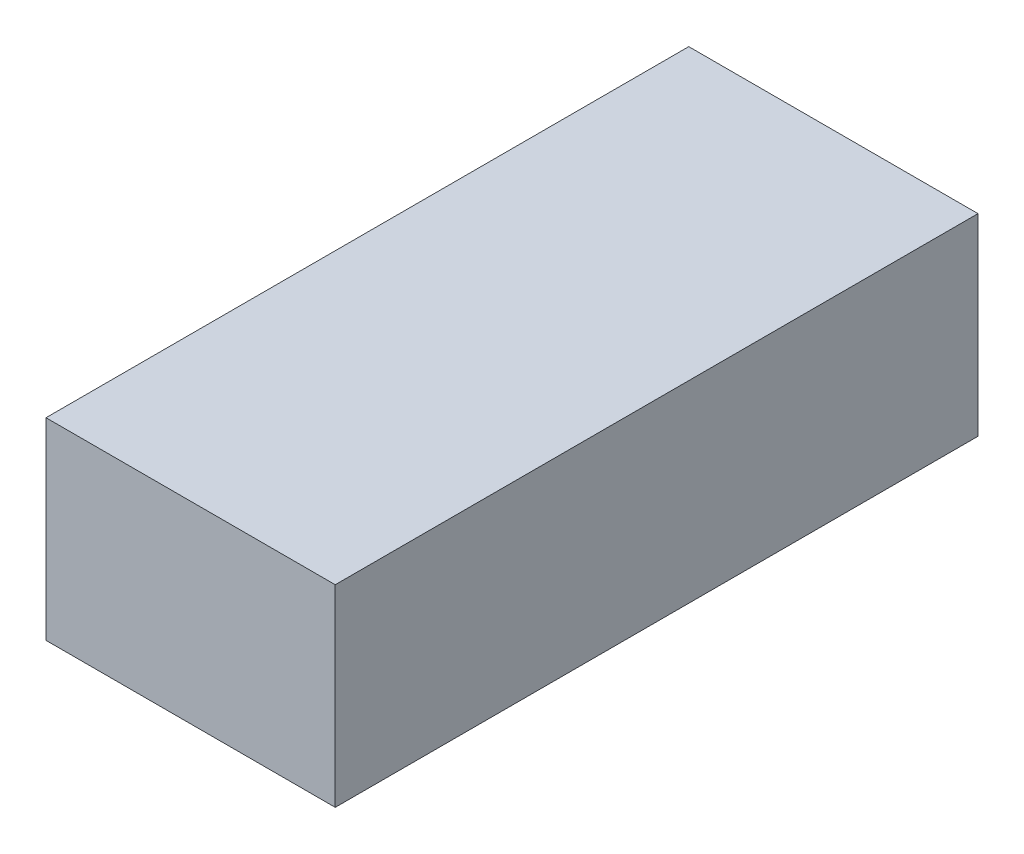
ISO-10303-21;
HEADER;
FILE_DESCRIPTION(('STEP AP214'),'2;1');
FILE_NAME('part.step','',(''),(''),'','','');
FILE_SCHEMA(('AUTOMOTIVE_DESIGN { 1 0 10303 214 1 1 1 1 }'));
ENDSEC;
DATA;
#1=APPLICATION_CONTEXT('core data for automotive mechanical design processes');
#2=APPLICATION_PROTOCOL_DEFINITION('international standard','automotive_design',2000,#1);
#3=PRODUCT_CONTEXT('',#1,'mechanical');
#4=PRODUCT('Part','Part','',(#3));
#5=PRODUCT_RELATED_PRODUCT_CATEGORY('part','',(#4));
#6=PRODUCT_DEFINITION_FORMATION('','',#4);
#7=PRODUCT_DEFINITION_CONTEXT('part definition',#1,'design');
#8=PRODUCT_DEFINITION('design','',#6,#7);
#9=PRODUCT_DEFINITION_SHAPE('','',#8);
#10=(LENGTH_UNIT() NAMED_UNIT(*) SI_UNIT(.MILLI.,.METRE.));
#11=(NAMED_UNIT(*) PLANE_ANGLE_UNIT() SI_UNIT($,.RADIAN.));
#12=(NAMED_UNIT(*) SI_UNIT($,.STERADIAN.) SOLID_ANGLE_UNIT());
#13=UNCERTAINTY_MEASURE_WITH_UNIT(LENGTH_MEASURE(1.E-05),#10,'distance_accuracy_value','');
#14=(GEOMETRIC_REPRESENTATION_CONTEXT(3) GLOBAL_UNCERTAINTY_ASSIGNED_CONTEXT((#13)) GLOBAL_UNIT_ASSIGNED_CONTEXT((#10,
#11,#12)) REPRESENTATION_CONTEXT('',''));
#15=CARTESIAN_POINT('',(0.,0.,0.));
#16=DIRECTION('',(0.,0.,1.));
#17=DIRECTION('',(1.,0.,0.));
#18=AXIS2_PLACEMENT_3D('',#15,#16,#17);
#19=CARTESIAN_POINT('',(-2.25,3.,-5.));
#20=DIRECTION('',(1.,0.,0.));
#21=DIRECTION('',(0.,0.,-1.));
#22=AXIS2_PLACEMENT_3D('',#19,#20,#21);
#23=PLANE('',#22);
#24=DIRECTION('',(0.,0.,1.));
#25=VECTOR('',#24,1.);
#26=CARTESIAN_POINT('',(-2.25,0.,-5.));
#27=LINE('',#26,#25);
#28=CARTESIAN_POINT('',(-2.25,0.,-5.));
#29=VERTEX_POINT('',#28);
#30=CARTESIAN_POINT('',(-2.25,0.,5.));
#31=VERTEX_POINT('',#30);
#32=EDGE_CURVE('E102',#29,#31,#27,.T.);
#33=ORIENTED_EDGE('',*,*,#32,.T.);
#34=DIRECTION('',(0.,-1.,0.));
#35=VECTOR('',#34,1.);
#36=CARTESIAN_POINT('',(-2.25,3.,5.));
#37=LINE('',#36,#35);
#38=CARTESIAN_POINT('',(-2.25,3.,5.));
#39=VERTEX_POINT('',#38);
#40=EDGE_CURVE('E11',#39,#31,#37,.T.);
#41=ORIENTED_EDGE('',*,*,#40,.F.);
#42=DIRECTION('',(0.,0.,1.));
#43=VECTOR('',#42,1.);
#44=CARTESIAN_POINT('',(-2.25,3.,-5.));
#45=LINE('',#44,#43);
#46=CARTESIAN_POINT('',(-2.25,3.,-5.));
#47=VERTEX_POINT('',#46);
#48=EDGE_CURVE('E90',#47,#39,#45,.T.);
#49=ORIENTED_EDGE('',*,*,#48,.F.);
#50=DIRECTION('',(0.,-1.,0.));
#51=VECTOR('',#50,1.);
#52=CARTESIAN_POINT('',(-2.25,3.,-5.));
#53=LINE('',#52,#51);
#54=EDGE_CURVE('E98',#47,#29,#53,.T.);
#55=ORIENTED_EDGE('',*,*,#54,.T.);
#56=EDGE_LOOP('',(#33,#41,#49,#55));
#57=FACE_BOUND('',#56,.T.);
#58=ADVANCED_FACE('F39',(#57),#23,.F.);
#59=CARTESIAN_POINT('',(2.25,3.,5.));
#60=DIRECTION('',(0.,0.,-1.));
#61=DIRECTION('',(-1.,0.,0.));
#62=AXIS2_PLACEMENT_3D('',#59,#60,#61);
#63=PLANE('',#62);
#64=DIRECTION('',(1.,0.,0.));
#65=VECTOR('',#64,1.);
#66=CARTESIAN_POINT('',(2.25,0.,5.));
#67=LINE('',#66,#65);
#68=CARTESIAN_POINT('',(2.25,0.,5.));
#69=VERTEX_POINT('',#68);
#70=EDGE_CURVE('E94',#31,#69,#67,.T.);
#71=ORIENTED_EDGE('',*,*,#70,.T.);
#72=DIRECTION('',(0.,-1.,0.));
#73=VECTOR('',#72,1.);
#74=CARTESIAN_POINT('',(2.25,3.,5.));
#75=LINE('',#74,#73);
#76=CARTESIAN_POINT('',(2.25,3.,5.));
#77=VERTEX_POINT('',#76);
#78=EDGE_CURVE('E47',#77,#69,#75,.T.);
#79=ORIENTED_EDGE('',*,*,#78,.F.);
#80=DIRECTION('',(1.,0.,0.));
#81=VECTOR('',#80,1.);
#82=CARTESIAN_POINT('',(2.25,3.,5.));
#83=LINE('',#82,#81);
#84=EDGE_CURVE('E85',#39,#77,#83,.T.);
#85=ORIENTED_EDGE('',*,*,#84,.F.);
#86=ORIENTED_EDGE('',*,*,#40,.T.);
#87=EDGE_LOOP('',(#71,#79,#85,#86));
#88=FACE_BOUND('',#87,.T.);
#89=ADVANCED_FACE('F93',(#88),#63,.F.);
#90=CARTESIAN_POINT('',(2.25,3.,-5.));
#91=DIRECTION('',(-1.,0.,0.));
#92=DIRECTION('',(0.,0.,1.));
#93=AXIS2_PLACEMENT_3D('',#90,#91,#92);
#94=PLANE('',#93);
#95=DIRECTION('',(0.,0.,-1.));
#96=VECTOR('',#95,1.);
#97=CARTESIAN_POINT('',(2.25,0.,-5.));
#98=LINE('',#97,#96);
#99=CARTESIAN_POINT('',(2.25,0.,-5.));
#100=VERTEX_POINT('',#99);
#101=EDGE_CURVE('E72',#69,#100,#98,.T.);
#102=ORIENTED_EDGE('',*,*,#101,.T.);
#103=DIRECTION('',(0.,-1.,0.));
#104=VECTOR('',#103,1.);
#105=CARTESIAN_POINT('',(2.25,3.,-5.));
#106=LINE('',#105,#104);
#107=CARTESIAN_POINT('',(2.25,3.,-5.));
#108=VERTEX_POINT('',#107);
#109=EDGE_CURVE('E95',#108,#100,#106,.T.);
#110=ORIENTED_EDGE('',*,*,#109,.F.);
#111=DIRECTION('',(0.,0.,-1.));
#112=VECTOR('',#111,1.);
#113=CARTESIAN_POINT('',(2.25,3.,-5.));
#114=LINE('',#113,#112);
#115=EDGE_CURVE('E88',#77,#108,#114,.T.);
#116=ORIENTED_EDGE('',*,*,#115,.F.);
#117=ORIENTED_EDGE('',*,*,#78,.T.);
#118=EDGE_LOOP('',(#102,#110,#116,#117));
#119=FACE_BOUND('',#118,.T.);
#120=ADVANCED_FACE('F96',(#119),#94,.F.);
#121=CARTESIAN_POINT('',(2.25,3.,-5.));
#122=DIRECTION('',(0.,0.,1.));
#123=DIRECTION('',(1.,0.,0.));
#124=AXIS2_PLACEMENT_3D('',#121,#122,#123);
#125=PLANE('',#124);
#126=DIRECTION('',(-1.,0.,0.));
#127=VECTOR('',#126,1.);
#128=CARTESIAN_POINT('',(2.25,0.,-5.));
#129=LINE('',#128,#127);
#130=EDGE_CURVE('E78',#100,#29,#129,.T.);
#131=ORIENTED_EDGE('',*,*,#130,.T.);
#132=ORIENTED_EDGE('',*,*,#54,.F.);
#133=DIRECTION('',(-1.,0.,0.));
#134=VECTOR('',#133,1.);
#135=CARTESIAN_POINT('',(2.25,3.,-5.));
#136=LINE('',#135,#134);
#137=EDGE_CURVE('E55',#108,#47,#136,.T.);
#138=ORIENTED_EDGE('',*,*,#137,.F.);
#139=ORIENTED_EDGE('',*,*,#109,.T.);
#140=EDGE_LOOP('',(#131,#132,#138,#139));
#141=FACE_BOUND('',#140,.T.);
#142=ADVANCED_FACE('F109',(#141),#125,.F.);
#143=CARTESIAN_POINT('',(0.,3.,0.));
#144=DIRECTION('',(0.,-1.,0.));
#145=DIRECTION('',(0.,0.,-1.));
#146=AXIS2_PLACEMENT_3D('',#143,#144,#145);
#147=PLANE('',#146);
#148=ORIENTED_EDGE('',*,*,#48,.T.);
#149=ORIENTED_EDGE('',*,*,#84,.T.);
#150=ORIENTED_EDGE('',*,*,#115,.T.);
#151=ORIENTED_EDGE('',*,*,#137,.T.);
#152=EDGE_LOOP('',(#148,#149,#150,#151));
#153=FACE_BOUND('',#152,.T.);
#154=ADVANCED_FACE('F86',(#153),#147,.F.);
#155=CARTESIAN_POINT('',(0.,0.,0.));
#156=DIRECTION('',(0.,-1.,0.));
#157=DIRECTION('',(0.,0.,-1.));
#158=AXIS2_PLACEMENT_3D('',#155,#156,#157);
#159=PLANE('',#158);
#160=ORIENTED_EDGE('',*,*,#32,.F.);
#161=ORIENTED_EDGE('',*,*,#130,.F.);
#162=ORIENTED_EDGE('',*,*,#101,.F.);
#163=ORIENTED_EDGE('',*,*,#70,.F.);
#164=EDGE_LOOP('',(#160,#161,#162,#163));
#165=FACE_BOUND('',#164,.T.);
#166=ADVANCED_FACE('F112',(#165),#159,.T.);
#167=CLOSED_SHELL('',(#58,#89,#120,#142,#154,#166));
#168=MANIFOLD_SOLID_BREP('B2',#167);
#169=ADVANCED_BREP_SHAPE_REPRESENTATION('',(#18,#168),#14);
#170=SHAPE_DEFINITION_REPRESENTATION(#9,#169);
ENDSEC;
END-ISO-10303-21;
